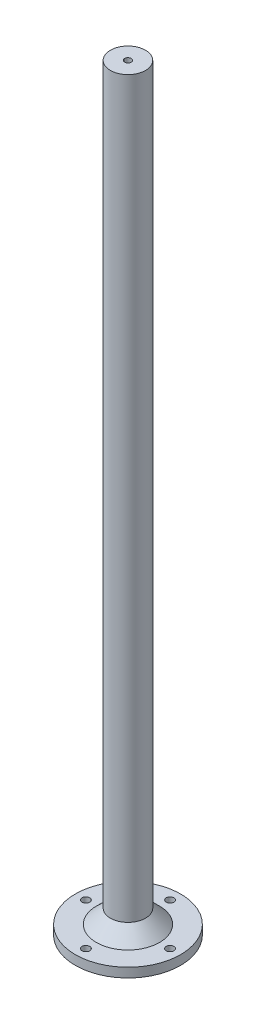
ISO-10303-21;
HEADER;
FILE_DESCRIPTION(('STEP AP214'),'2;1');
FILE_NAME('part.step','',(''),(''),'','','');
FILE_SCHEMA(('AUTOMOTIVE_DESIGN { 1 0 10303 214 1 1 1 1 }'));
ENDSEC;
DATA;
#1=APPLICATION_CONTEXT('core data for automotive mechanical design processes');
#2=APPLICATION_PROTOCOL_DEFINITION('international standard','automotive_design',2000,#1);
#3=PRODUCT_CONTEXT('',#1,'mechanical');
#4=PRODUCT('Part','Part','',(#3));
#5=PRODUCT_RELATED_PRODUCT_CATEGORY('part','',(#4));
#6=PRODUCT_DEFINITION_FORMATION('','',#4);
#7=PRODUCT_DEFINITION_CONTEXT('part definition',#1,'design');
#8=PRODUCT_DEFINITION('design','',#6,#7);
#9=PRODUCT_DEFINITION_SHAPE('','',#8);
#10=(LENGTH_UNIT() NAMED_UNIT(*) SI_UNIT(.MILLI.,.METRE.));
#11=(NAMED_UNIT(*) PLANE_ANGLE_UNIT() SI_UNIT($,.RADIAN.));
#12=(NAMED_UNIT(*) SI_UNIT($,.STERADIAN.) SOLID_ANGLE_UNIT());
#13=UNCERTAINTY_MEASURE_WITH_UNIT(LENGTH_MEASURE(1.E-05),#10,'distance_accuracy_value','');
#14=(GEOMETRIC_REPRESENTATION_CONTEXT(3) GLOBAL_UNCERTAINTY_ASSIGNED_CONTEXT((#13)) GLOBAL_UNIT_ASSIGNED_CONTEXT((#10,
#11,#12)) REPRESENTATION_CONTEXT('',''));
#15=CARTESIAN_POINT('',(0.,0.,0.));
#16=DIRECTION('',(0.,0.,1.));
#17=DIRECTION('',(1.,0.,0.));
#18=AXIS2_PLACEMENT_3D('',#15,#16,#17);
#19=CARTESIAN_POINT('',(0.,4.,0.));
#20=DIRECTION('',(0.,1.,0.));
#21=DIRECTION('',(0.,0.,1.));
#22=AXIS2_PLACEMENT_3D('',#19,#20,#21);
#23=PLANE('',#22);
#24=CARTESIAN_POINT('',(0.,4.,0.));
#25=DIRECTION('',(0.,1.,0.));
#26=DIRECTION('',(0.,0.,1.));
#27=AXIS2_PLACEMENT_3D('',#24,#25,#26);
#28=CIRCLE('',#27,13.5000000000001);
#29=CARTESIAN_POINT('',(0.,4.,13.5000000000001));
#30=VERTEX_POINT('',#29);
#31=EDGE_CURVE('E10',#30,#30,#28,.F.);
#32=ORIENTED_EDGE('',*,*,#31,.T.);
#33=EDGE_LOOP('',(#32));
#34=FACE_BOUND('',#33,.T.);
#35=CARTESIAN_POINT('',(0.,4.,-18.));
#36=DIRECTION('',(0.,1.,0.));
#37=DIRECTION('',(0.,0.,1.));
#38=AXIS2_PLACEMENT_3D('',#35,#36,#37);
#39=CIRCLE('',#38,1.65);
#40=CARTESIAN_POINT('',(0.,4.,-16.35));
#41=VERTEX_POINT('',#40);
#42=EDGE_CURVE('E70',#41,#41,#39,.T.);
#43=ORIENTED_EDGE('',*,*,#42,.F.);
#44=EDGE_LOOP('',(#43));
#45=FACE_BOUND('',#44,.T.);
#46=CARTESIAN_POINT('',(-18.,4.,0.));
#47=DIRECTION('',(0.,1.,0.));
#48=DIRECTION('',(0.,0.,1.));
#49=AXIS2_PLACEMENT_3D('',#46,#47,#48);
#50=CIRCLE('',#49,1.65);
#51=CARTESIAN_POINT('',(-18.,4.,1.65));
#52=VERTEX_POINT('',#51);
#53=EDGE_CURVE('E59',#52,#52,#50,.T.);
#54=ORIENTED_EDGE('',*,*,#53,.F.);
#55=EDGE_LOOP('',(#54));
#56=FACE_BOUND('',#55,.T.);
#57=CARTESIAN_POINT('',(0.,4.,0.));
#58=DIRECTION('',(0.,1.,0.));
#59=DIRECTION('',(0.,0.,1.));
#60=AXIS2_PLACEMENT_3D('',#57,#58,#59);
#61=CIRCLE('',#60,22.5);
#62=CARTESIAN_POINT('',(0.,4.,22.5));
#63=VERTEX_POINT('',#62);
#64=EDGE_CURVE('E51',#63,#63,#61,.T.);
#65=ORIENTED_EDGE('',*,*,#64,.T.);
#66=EDGE_LOOP('',(#65));
#67=FACE_BOUND('',#66,.T.);
#68=CARTESIAN_POINT('',(18.,4.,0.));
#69=DIRECTION('',(0.,1.,0.));
#70=DIRECTION('',(0.,0.,1.));
#71=AXIS2_PLACEMENT_3D('',#68,#69,#70);
#72=CIRCLE('',#71,1.65);
#73=CARTESIAN_POINT('',(18.,4.,1.65));
#74=VERTEX_POINT('',#73);
#75=EDGE_CURVE('E64',#74,#74,#72,.T.);
#76=ORIENTED_EDGE('',*,*,#75,.F.);
#77=EDGE_LOOP('',(#76));
#78=FACE_BOUND('',#77,.T.);
#79=CARTESIAN_POINT('',(0.,4.,18.));
#80=DIRECTION('',(0.,1.,0.));
#81=DIRECTION('',(0.,0.,1.));
#82=AXIS2_PLACEMENT_3D('',#79,#80,#81);
#83=CIRCLE('',#82,1.65);
#84=CARTESIAN_POINT('',(0.,4.,19.65));
#85=VERTEX_POINT('',#84);
#86=EDGE_CURVE('E76',#85,#85,#83,.T.);
#87=ORIENTED_EDGE('',*,*,#86,.F.);
#88=EDGE_LOOP('',(#87));
#89=FACE_BOUND('',#88,.T.);
#90=ADVANCED_FACE('F39',(#34,#45,#56,#67,#78,#89),#23,.T.);
#91=CARTESIAN_POINT('',(0.,0.,0.));
#92=DIRECTION('',(0.,1.,0.));
#93=DIRECTION('',(0.,0.,1.));
#94=AXIS2_PLACEMENT_3D('',#91,#92,#93);
#95=PLANE('',#94);
#96=CARTESIAN_POINT('',(0.,0.,0.));
#97=DIRECTION('',(0.,1.,0.));
#98=DIRECTION('',(0.,0.,1.));
#99=AXIS2_PLACEMENT_3D('',#96,#97,#98);
#100=CIRCLE('',#99,22.5);
#101=CARTESIAN_POINT('',(0.,0.,22.5));
#102=VERTEX_POINT('',#101);
#103=EDGE_CURVE('E55',#102,#102,#100,.T.);
#104=ORIENTED_EDGE('',*,*,#103,.F.);
#105=EDGE_LOOP('',(#104));
#106=FACE_BOUND('',#105,.T.);
#107=CARTESIAN_POINT('',(-18.,0.,0.));
#108=DIRECTION('',(0.,1.,0.));
#109=DIRECTION('',(0.,0.,1.));
#110=AXIS2_PLACEMENT_3D('',#107,#108,#109);
#111=CIRCLE('',#110,1.65);
#112=CARTESIAN_POINT('',(-18.,0.,1.65));
#113=VERTEX_POINT('',#112);
#114=EDGE_CURVE('E61',#113,#113,#111,.T.);
#115=ORIENTED_EDGE('',*,*,#114,.T.);
#116=EDGE_LOOP('',(#115));
#117=FACE_BOUND('',#116,.T.);
#118=CARTESIAN_POINT('',(18.,0.,0.));
#119=DIRECTION('',(0.,1.,0.));
#120=DIRECTION('',(0.,0.,1.));
#121=AXIS2_PLACEMENT_3D('',#118,#119,#120);
#122=CIRCLE('',#121,1.65);
#123=CARTESIAN_POINT('',(18.,0.,1.65));
#124=VERTEX_POINT('',#123);
#125=EDGE_CURVE('E67',#124,#124,#122,.T.);
#126=ORIENTED_EDGE('',*,*,#125,.T.);
#127=EDGE_LOOP('',(#126));
#128=FACE_BOUND('',#127,.T.);
#129=CARTESIAN_POINT('',(0.,0.,-18.));
#130=DIRECTION('',(0.,1.,0.));
#131=DIRECTION('',(0.,0.,1.));
#132=AXIS2_PLACEMENT_3D('',#129,#130,#131);
#133=CIRCLE('',#132,1.65);
#134=CARTESIAN_POINT('',(0.,0.,-16.35));
#135=VERTEX_POINT('',#134);
#136=EDGE_CURVE('E73',#135,#135,#133,.T.);
#137=ORIENTED_EDGE('',*,*,#136,.T.);
#138=EDGE_LOOP('',(#137));
#139=FACE_BOUND('',#138,.T.);
#140=CARTESIAN_POINT('',(0.,0.,18.));
#141=DIRECTION('',(0.,1.,0.));
#142=DIRECTION('',(0.,0.,1.));
#143=AXIS2_PLACEMENT_3D('',#140,#141,#142);
#144=CIRCLE('',#143,1.65);
#145=CARTESIAN_POINT('',(0.,0.,19.65));
#146=VERTEX_POINT('',#145);
#147=EDGE_CURVE('E79',#146,#146,#144,.T.);
#148=ORIENTED_EDGE('',*,*,#147,.T.);
#149=EDGE_LOOP('',(#148));
#150=FACE_BOUND('',#149,.T.);
#151=ADVANCED_FACE('F119',(#106,#117,#128,#139,#150),#95,.F.);
#152=CARTESIAN_POINT('',(0.,4.,0.));
#153=DIRECTION('',(0.,-1.,0.));
#154=DIRECTION('',(0.,0.,-1.));
#155=AXIS2_PLACEMENT_3D('',#152,#153,#154);
#156=CYLINDRICAL_SURFACE('',#155,22.5);
#157=ORIENTED_EDGE('',*,*,#64,.F.);
#158=EDGE_LOOP('',(#157));
#159=FACE_BOUND('',#158,.T.);
#160=ORIENTED_EDGE('',*,*,#103,.T.);
#161=EDGE_LOOP('',(#160));
#162=FACE_BOUND('',#161,.T.);
#163=ADVANCED_FACE('F124',(#159,#162),#156,.T.);
#164=CARTESIAN_POINT('',(-18.,4.,0.));
#165=DIRECTION('',(0.,-1.,0.));
#166=DIRECTION('',(0.,0.,-1.));
#167=AXIS2_PLACEMENT_3D('',#164,#165,#166);
#168=CYLINDRICAL_SURFACE('',#167,1.65);
#169=ORIENTED_EDGE('',*,*,#53,.T.);
#170=EDGE_LOOP('',(#169));
#171=FACE_BOUND('',#170,.T.);
#172=ORIENTED_EDGE('',*,*,#114,.F.);
#173=EDGE_LOOP('',(#172));
#174=FACE_BOUND('',#173,.T.);
#175=ADVANCED_FACE('F129',(#171,#174),#168,.F.);
#176=CARTESIAN_POINT('',(18.,4.,0.));
#177=DIRECTION('',(0.,-1.,0.));
#178=DIRECTION('',(0.,0.,-1.));
#179=AXIS2_PLACEMENT_3D('',#176,#177,#178);
#180=CYLINDRICAL_SURFACE('',#179,1.65);
#181=ORIENTED_EDGE('',*,*,#75,.T.);
#182=EDGE_LOOP('',(#181));
#183=FACE_BOUND('',#182,.T.);
#184=ORIENTED_EDGE('',*,*,#125,.F.);
#185=EDGE_LOOP('',(#184));
#186=FACE_BOUND('',#185,.T.);
#187=ADVANCED_FACE('F136',(#183,#186),#180,.F.);
#188=CARTESIAN_POINT('',(0.,4.,-18.));
#189=DIRECTION('',(0.,-1.,0.));
#190=DIRECTION('',(0.,0.,-1.));
#191=AXIS2_PLACEMENT_3D('',#188,#189,#190);
#192=CYLINDRICAL_SURFACE('',#191,1.65);
#193=ORIENTED_EDGE('',*,*,#42,.T.);
#194=EDGE_LOOP('',(#193));
#195=FACE_BOUND('',#194,.T.);
#196=ORIENTED_EDGE('',*,*,#136,.F.);
#197=EDGE_LOOP('',(#196));
#198=FACE_BOUND('',#197,.T.);
#199=ADVANCED_FACE('F115',(#195,#198),#192,.F.);
#200=CARTESIAN_POINT('',(0.,4.,18.));
#201=DIRECTION('',(0.,-1.,0.));
#202=DIRECTION('',(0.,0.,-1.));
#203=AXIS2_PLACEMENT_3D('',#200,#201,#202);
#204=CYLINDRICAL_SURFACE('',#203,1.65);
#205=ORIENTED_EDGE('',*,*,#86,.T.);
#206=EDGE_LOOP('',(#205));
#207=FACE_BOUND('',#206,.T.);
#208=ORIENTED_EDGE('',*,*,#147,.F.);
#209=EDGE_LOOP('',(#208));
#210=FACE_BOUND('',#209,.T.);
#211=ADVANCED_FACE('F110',(#207,#210),#204,.F.);
#212=CARTESIAN_POINT('',(0.,324.,0.));
#213=DIRECTION('',(0.,-1.,0.));
#214=DIRECTION('',(0.,0.,-1.));
#215=AXIS2_PLACEMENT_3D('',#212,#213,#214);
#216=CYLINDRICAL_SURFACE('',#215,7.5);
#217=CARTESIAN_POINT('',(0.,10.0000000000001,0.));
#218=DIRECTION('',(0.,1.,0.));
#219=DIRECTION('',(0.,0.,1.));
#220=AXIS2_PLACEMENT_3D('',#217,#218,#219);
#221=CIRCLE('',#220,7.5);
#222=CARTESIAN_POINT('',(0.,10.0000000000001,7.5));
#223=VERTEX_POINT('',#222);
#224=EDGE_CURVE('E47',#223,#223,#221,.T.);
#225=ORIENTED_EDGE('',*,*,#224,.T.);
#226=EDGE_LOOP('',(#225));
#227=FACE_BOUND('',#226,.T.);
#228=CARTESIAN_POINT('',(0.,324.,0.));
#229=DIRECTION('',(0.,1.,0.));
#230=DIRECTION('',(0.,0.,1.));
#231=AXIS2_PLACEMENT_3D('',#228,#229,#230);
#232=CIRCLE('',#231,7.5);
#233=CARTESIAN_POINT('',(0.,324.,7.5));
#234=VERTEX_POINT('',#233);
#235=EDGE_CURVE('E82',#234,#234,#232,.T.);
#236=ORIENTED_EDGE('',*,*,#235,.F.);
#237=EDGE_LOOP('',(#236));
#238=FACE_BOUND('',#237,.T.);
#239=ADVANCED_FACE('F105',(#227,#238),#216,.T.);
#240=CARTESIAN_POINT('',(0.,324.,0.));
#241=DIRECTION('',(0.,1.,0.));
#242=DIRECTION('',(0.,0.,1.));
#243=AXIS2_PLACEMENT_3D('',#240,#241,#242);
#244=PLANE('',#243);
#245=CARTESIAN_POINT('',(0.,324.,0.));
#246=DIRECTION('',(0.,1.,0.));
#247=DIRECTION('',(0.,0.,1.));
#248=AXIS2_PLACEMENT_3D('',#245,#246,#247);
#249=CIRCLE('',#248,1.4);
#250=CARTESIAN_POINT('',(0.,324.,1.4));
#251=VERTEX_POINT('',#250);
#252=EDGE_CURVE('E88',#251,#251,#249,.T.);
#253=ORIENTED_EDGE('',*,*,#252,.F.);
#254=EDGE_LOOP('',(#253));
#255=FACE_BOUND('',#254,.T.);
#256=ORIENTED_EDGE('',*,*,#235,.T.);
#257=EDGE_LOOP('',(#256));
#258=FACE_BOUND('',#257,.T.);
#259=ADVANCED_FACE('F99',(#255,#258),#244,.T.);
#260=CARTESIAN_POINT('',(0.,314.,0.));
#261=DIRECTION('',(0.,1.,0.));
#262=DIRECTION('',(0.,0.,1.));
#263=AXIS2_PLACEMENT_3D('',#260,#261,#262);
#264=CYLINDRICAL_SURFACE('',#263,1.4);
#265=CARTESIAN_POINT('',(0.,314.,0.));
#266=DIRECTION('',(0.,1.,0.));
#267=DIRECTION('',(0.,0.,1.));
#268=AXIS2_PLACEMENT_3D('',#265,#266,#267);
#269=CIRCLE('',#268,1.4);
#270=CARTESIAN_POINT('',(0.,314.,1.4));
#271=VERTEX_POINT('',#270);
#272=EDGE_CURVE('E87',#271,#271,#269,.T.);
#273=ORIENTED_EDGE('',*,*,#272,.F.);
#274=EDGE_LOOP('',(#273));
#275=FACE_BOUND('',#274,.T.);
#276=ORIENTED_EDGE('',*,*,#252,.T.);
#277=EDGE_LOOP('',(#276));
#278=FACE_BOUND('',#277,.T.);
#279=ADVANCED_FACE('F96',(#275,#278),#264,.F.);
#280=CARTESIAN_POINT('',(0.,314.,0.));
#281=DIRECTION('',(0.,1.,0.));
#282=DIRECTION('',(0.,0.,1.));
#283=AXIS2_PLACEMENT_3D('',#280,#281,#282);
#284=PLANE('',#283);
#285=ORIENTED_EDGE('',*,*,#272,.T.);
#286=EDGE_LOOP('',(#285));
#287=FACE_BOUND('',#286,.T.);
#288=ADVANCED_FACE('F94',(#287),#284,.T.);
#289=CARTESIAN_POINT('',(0.,10.0000000000001,0.));
#290=DIRECTION('',(0.,-1.,0.));
#291=DIRECTION('',(0.,0.,-1.));
#292=AXIS2_PLACEMENT_3D('',#289,#290,#291);
#293=CONICAL_SURFACE('',#292,7.5,0.785398163397444);
#294=ORIENTED_EDGE('',*,*,#31,.F.);
#295=EDGE_LOOP('',(#294));
#296=FACE_BOUND('',#295,.T.);
#297=ORIENTED_EDGE('',*,*,#224,.F.);
#298=EDGE_LOOP('',(#297));
#299=FACE_BOUND('',#298,.T.);
#300=ADVANCED_FACE('F42',(#296,#299),#293,.T.);
#301=CLOSED_SHELL('',(#90,#151,#163,#175,#187,#199,#211,#239,#259,#279,#288,#300));
#302=MANIFOLD_SOLID_BREP('B2',#301);
#303=ADVANCED_BREP_SHAPE_REPRESENTATION('',(#18,#302),#14);
#304=SHAPE_DEFINITION_REPRESENTATION(#9,#303);
ENDSEC;
END-ISO-10303-21;
